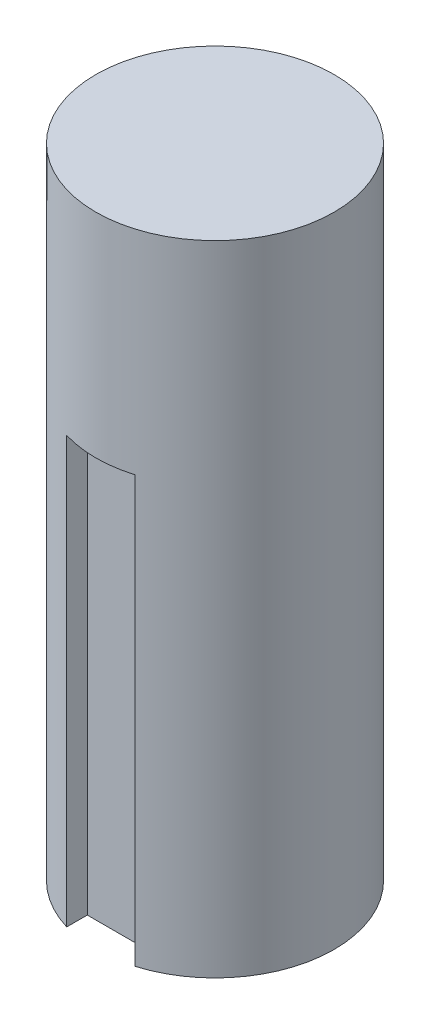
ISO-10303-21;
HEADER;
FILE_DESCRIPTION(('STEP AP214'),'2;1');
FILE_NAME('part.step','',(''),(''),'','','');
FILE_SCHEMA(('AUTOMOTIVE_DESIGN { 1 0 10303 214 1 1 1 1 }'));
ENDSEC;
DATA;
#1=APPLICATION_CONTEXT('core data for automotive mechanical design processes');
#2=APPLICATION_PROTOCOL_DEFINITION('international standard','automotive_design',2000,#1);
#3=PRODUCT_CONTEXT('',#1,'mechanical');
#4=PRODUCT('Part','Part','',(#3));
#5=PRODUCT_RELATED_PRODUCT_CATEGORY('part','',(#4));
#6=PRODUCT_DEFINITION_FORMATION('','',#4);
#7=PRODUCT_DEFINITION_CONTEXT('part definition',#1,'design');
#8=PRODUCT_DEFINITION('design','',#6,#7);
#9=PRODUCT_DEFINITION_SHAPE('','',#8);
#10=(LENGTH_UNIT() NAMED_UNIT(*) SI_UNIT(.MILLI.,.METRE.));
#11=(NAMED_UNIT(*) PLANE_ANGLE_UNIT() SI_UNIT($,.RADIAN.));
#12=(NAMED_UNIT(*) SI_UNIT($,.STERADIAN.) SOLID_ANGLE_UNIT());
#13=UNCERTAINTY_MEASURE_WITH_UNIT(LENGTH_MEASURE(1.E-05),#10,'distance_accuracy_value','');
#14=(GEOMETRIC_REPRESENTATION_CONTEXT(3) GLOBAL_UNCERTAINTY_ASSIGNED_CONTEXT((#13)) GLOBAL_UNIT_ASSIGNED_CONTEXT((#10,
#11,#12)) REPRESENTATION_CONTEXT('',''));
#15=CARTESIAN_POINT('',(0.,0.,0.));
#16=DIRECTION('',(0.,0.,1.));
#17=DIRECTION('',(1.,0.,0.));
#18=AXIS2_PLACEMENT_3D('',#15,#16,#17);
#19=CARTESIAN_POINT('',(0.,150.,0.));
#20=DIRECTION('',(0.,-1.,0.));
#21=DIRECTION('',(0.,0.,-1.));
#22=AXIS2_PLACEMENT_3D('',#19,#20,#21);
#23=CYLINDRICAL_SURFACE('',#22,28.);
#24=CARTESIAN_POINT('',(0.,150.,0.));
#25=DIRECTION('',(0.,1.,0.));
#26=DIRECTION('',(0.,0.,1.));
#27=AXIS2_PLACEMENT_3D('',#24,#25,#26);
#28=CIRCLE('',#27,28.);
#29=CARTESIAN_POINT('',(0.,150.,28.));
#30=VERTEX_POINT('',#29);
#31=EDGE_CURVE('E100',#30,#30,#28,.T.);
#32=ORIENTED_EDGE('',*,*,#31,.F.);
#33=EDGE_LOOP('',(#32));
#34=FACE_BOUND('',#33,.T.);
#35=CARTESIAN_POINT('',(0.,100.,0.));
#36=DIRECTION('',(0.,1.,0.));
#37=DIRECTION('',(0.,0.,1.));
#38=AXIS2_PLACEMENT_3D('',#35,#36,#37);
#39=CIRCLE('',#38,28.);
#40=CARTESIAN_POINT('',(-7.99999999999999,100.,26.8328157299975));
#41=VERTEX_POINT('',#40);
#42=CARTESIAN_POINT('',(8.00000000000001,100.,26.8328157299975));
#43=VERTEX_POINT('',#42);
#44=EDGE_CURVE('E11',#41,#43,#39,.T.);
#45=ORIENTED_EDGE('',*,*,#44,.T.);
#46=DIRECTION('',(0.,-1.,0.));
#47=VECTOR('',#46,1.);
#48=CARTESIAN_POINT('',(8.00000000000001,150.,26.8328157299975));
#49=LINE('',#48,#47);
#50=CARTESIAN_POINT('',(8.,0.,26.8328157299975));
#51=VERTEX_POINT('',#50);
#52=EDGE_CURVE('E97',#43,#51,#49,.T.);
#53=ORIENTED_EDGE('',*,*,#52,.T.);
#54=CARTESIAN_POINT('',(0.,0.,0.));
#55=DIRECTION('',(0.,1.,0.));
#56=DIRECTION('',(0.,0.,1.));
#57=AXIS2_PLACEMENT_3D('',#54,#55,#56);
#58=CIRCLE('',#57,28.);
#59=CARTESIAN_POINT('',(-7.99999999999999,0.,26.8328157299975));
#60=VERTEX_POINT('',#59);
#61=EDGE_CURVE('E99',#51,#60,#58,.T.);
#62=ORIENTED_EDGE('',*,*,#61,.T.);
#63=DIRECTION('',(0.,-1.,0.));
#64=VECTOR('',#63,1.);
#65=CARTESIAN_POINT('',(-7.99999999999999,150.,26.8328157299975));
#66=LINE('',#65,#64);
#67=EDGE_CURVE('E46',#60,#41,#66,.F.);
#68=ORIENTED_EDGE('',*,*,#67,.T.);
#69=EDGE_LOOP('',(#45,#53,#62,#68));
#70=FACE_BOUND('',#69,.T.);
#71=ADVANCED_FACE('F32',(#34,#70),#23,.T.);
#72=CARTESIAN_POINT('',(0.,150.,0.));
#73=DIRECTION('',(0.,1.,0.));
#74=DIRECTION('',(0.,0.,1.));
#75=AXIS2_PLACEMENT_3D('',#72,#73,#74);
#76=PLANE('',#75);
#77=ORIENTED_EDGE('',*,*,#31,.T.);
#78=EDGE_LOOP('',(#77));
#79=FACE_BOUND('',#78,.T.);
#80=ADVANCED_FACE('F120',(#79),#76,.T.);
#81=CARTESIAN_POINT('',(0.,0.,0.));
#82=DIRECTION('',(0.,1.,0.));
#83=DIRECTION('',(0.,0.,1.));
#84=AXIS2_PLACEMENT_3D('',#81,#82,#83);
#85=PLANE('',#84);
#86=ORIENTED_EDGE('',*,*,#61,.F.);
#87=DIRECTION('',(0.,0.,1.));
#88=VECTOR('',#87,1.);
#89=CARTESIAN_POINT('',(8.00000000000001,0.,22.));
#90=LINE('',#89,#88);
#91=CARTESIAN_POINT('',(8.00000000000001,0.,22.));
#92=VERTEX_POINT('',#91);
#93=EDGE_CURVE('E91',#92,#51,#90,.T.);
#94=ORIENTED_EDGE('',*,*,#93,.F.);
#95=DIRECTION('',(1.,0.,0.));
#96=VECTOR('',#95,1.);
#97=CARTESIAN_POINT('',(-7.99999999999999,0.,22.));
#98=LINE('',#97,#96);
#99=CARTESIAN_POINT('',(-7.99999999999999,0.,22.));
#100=VERTEX_POINT('',#99);
#101=EDGE_CURVE('E93',#100,#92,#98,.T.);
#102=ORIENTED_EDGE('',*,*,#101,.F.);
#103=DIRECTION('',(0.,0.,1.));
#104=VECTOR('',#103,1.);
#105=CARTESIAN_POINT('',(-7.99999999999999,0.,0.));
#106=LINE('',#105,#104);
#107=EDGE_CURVE('E39',#100,#60,#106,.T.);
#108=ORIENTED_EDGE('',*,*,#107,.T.);
#109=EDGE_LOOP('',(#86,#94,#102,#108));
#110=FACE_BOUND('',#109,.T.);
#111=ADVANCED_FACE('F106',(#110),#85,.F.);
#112=CARTESIAN_POINT('',(0.,100.,0.));
#113=DIRECTION('',(0.,1.,0.));
#114=DIRECTION('',(0.,0.,1.));
#115=AXIS2_PLACEMENT_3D('',#112,#113,#114);
#116=PLANE('',#115);
#117=ORIENTED_EDGE('',*,*,#44,.F.);
#118=DIRECTION('',(0.,0.,-1.));
#119=VECTOR('',#118,1.);
#120=CARTESIAN_POINT('',(-7.99999999999999,100.,22.));
#121=LINE('',#120,#119);
#122=CARTESIAN_POINT('',(-7.99999999999999,100.,22.));
#123=VERTEX_POINT('',#122);
#124=EDGE_CURVE('E70',#41,#123,#121,.T.);
#125=ORIENTED_EDGE('',*,*,#124,.T.);
#126=DIRECTION('',(1.,0.,0.));
#127=VECTOR('',#126,1.);
#128=CARTESIAN_POINT('',(-7.99999999999999,100.,22.));
#129=LINE('',#128,#127);
#130=CARTESIAN_POINT('',(8.00000000000001,100.,22.));
#131=VERTEX_POINT('',#130);
#132=EDGE_CURVE('E75',#123,#131,#129,.T.);
#133=ORIENTED_EDGE('',*,*,#132,.T.);
#134=DIRECTION('',(0.,0.,1.));
#135=VECTOR('',#134,1.);
#136=CARTESIAN_POINT('',(8.00000000000001,100.,22.));
#137=LINE('',#136,#135);
#138=EDGE_CURVE('E76',#131,#43,#137,.T.);
#139=ORIENTED_EDGE('',*,*,#138,.T.);
#140=EDGE_LOOP('',(#117,#125,#133,#139));
#141=FACE_BOUND('',#140,.T.);
#142=ADVANCED_FACE('F72',(#141),#116,.F.);
#143=CARTESIAN_POINT('',(8.00000000000001,100.,22.));
#144=DIRECTION('',(1.,0.,0.));
#145=DIRECTION('',(0.,0.,-1.));
#146=AXIS2_PLACEMENT_3D('',#143,#144,#145);
#147=PLANE('',#146);
#148=ORIENTED_EDGE('',*,*,#138,.F.);
#149=DIRECTION('',(0.,-1.,0.));
#150=VECTOR('',#149,1.);
#151=CARTESIAN_POINT('',(8.00000000000001,100.,22.));
#152=LINE('',#151,#150);
#153=EDGE_CURVE('E84',#131,#92,#152,.T.);
#154=ORIENTED_EDGE('',*,*,#153,.T.);
#155=ORIENTED_EDGE('',*,*,#93,.T.);
#156=ORIENTED_EDGE('',*,*,#52,.F.);
#157=EDGE_LOOP('',(#148,#154,#155,#156));
#158=FACE_BOUND('',#157,.T.);
#159=ADVANCED_FACE('F109',(#158),#147,.F.);
#160=CARTESIAN_POINT('',(-7.99999999999999,100.,22.));
#161=DIRECTION('',(-1.,0.,0.));
#162=DIRECTION('',(0.,0.,1.));
#163=AXIS2_PLACEMENT_3D('',#160,#161,#162);
#164=PLANE('',#163);
#165=ORIENTED_EDGE('',*,*,#107,.F.);
#166=DIRECTION('',(0.,-1.,0.));
#167=VECTOR('',#166,1.);
#168=CARTESIAN_POINT('',(-7.99999999999999,100.,22.));
#169=LINE('',#168,#167);
#170=EDGE_CURVE('E79',#123,#100,#169,.T.);
#171=ORIENTED_EDGE('',*,*,#170,.F.);
#172=ORIENTED_EDGE('',*,*,#124,.F.);
#173=ORIENTED_EDGE('',*,*,#67,.F.);
#174=EDGE_LOOP('',(#165,#171,#172,#173));
#175=FACE_BOUND('',#174,.T.);
#176=ADVANCED_FACE('F80',(#175),#164,.F.);
#177=CARTESIAN_POINT('',(-7.99999999999999,100.,22.));
#178=DIRECTION('',(0.,0.,-1.));
#179=DIRECTION('',(-1.,0.,0.));
#180=AXIS2_PLACEMENT_3D('',#177,#178,#179);
#181=PLANE('',#180);
#182=ORIENTED_EDGE('',*,*,#101,.T.);
#183=ORIENTED_EDGE('',*,*,#153,.F.);
#184=ORIENTED_EDGE('',*,*,#132,.F.);
#185=ORIENTED_EDGE('',*,*,#170,.T.);
#186=EDGE_LOOP('',(#182,#183,#184,#185));
#187=FACE_BOUND('',#186,.T.);
#188=ADVANCED_FACE('F86',(#187),#181,.F.);
#189=CLOSED_SHELL('',(#71,#80,#111,#142,#159,#176,#188));
#190=MANIFOLD_SOLID_BREP('B2',#189);
#191=ADVANCED_BREP_SHAPE_REPRESENTATION('',(#18,#190),#14);
#192=SHAPE_DEFINITION_REPRESENTATION(#9,#191);
ENDSEC;
END-ISO-10303-21;
